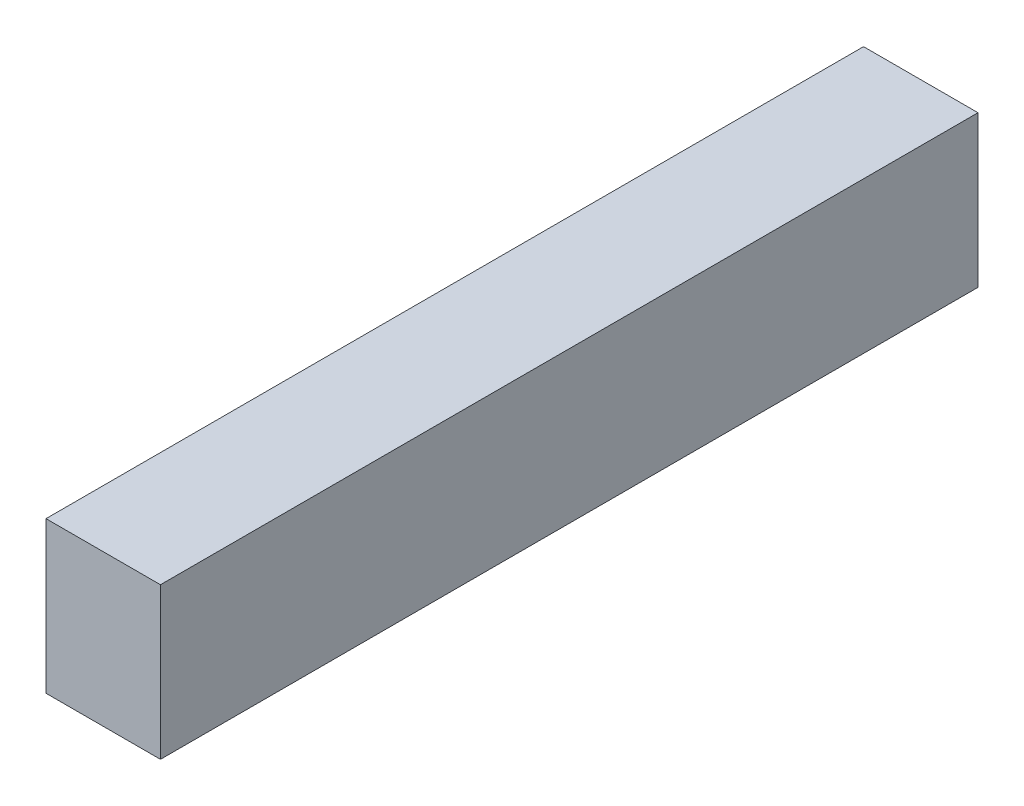
ISO-10303-21;
HEADER;
FILE_DESCRIPTION(('STEP AP214'),'2;1');
FILE_NAME('part.step','',(''),(''),'','','');
FILE_SCHEMA(('AUTOMOTIVE_DESIGN { 1 0 10303 214 1 1 1 1 }'));
ENDSEC;
DATA;
#1=APPLICATION_CONTEXT('core data for automotive mechanical design processes');
#2=APPLICATION_PROTOCOL_DEFINITION('international standard','automotive_design',2000,#1);
#3=PRODUCT_CONTEXT('',#1,'mechanical');
#4=PRODUCT('Part','Part','',(#3));
#5=PRODUCT_RELATED_PRODUCT_CATEGORY('part','',(#4));
#6=PRODUCT_DEFINITION_FORMATION('','',#4);
#7=PRODUCT_DEFINITION_CONTEXT('part definition',#1,'design');
#8=PRODUCT_DEFINITION('design','',#6,#7);
#9=PRODUCT_DEFINITION_SHAPE('','',#8);
#10=(LENGTH_UNIT() NAMED_UNIT(*) SI_UNIT(.MILLI.,.METRE.));
#11=(NAMED_UNIT(*) PLANE_ANGLE_UNIT() SI_UNIT($,.RADIAN.));
#12=(NAMED_UNIT(*) SI_UNIT($,.STERADIAN.) SOLID_ANGLE_UNIT());
#13=UNCERTAINTY_MEASURE_WITH_UNIT(LENGTH_MEASURE(1.E-05),#10,'distance_accuracy_value','');
#14=(GEOMETRIC_REPRESENTATION_CONTEXT(3) GLOBAL_UNCERTAINTY_ASSIGNED_CONTEXT((#13)) GLOBAL_UNIT_ASSIGNED_CONTEXT((#10,
#11,#12)) REPRESENTATION_CONTEXT('',''));
#15=CARTESIAN_POINT('',(0.,0.,0.));
#16=DIRECTION('',(0.,0.,1.));
#17=DIRECTION('',(1.,0.,0.));
#18=AXIS2_PLACEMENT_3D('',#15,#16,#17);
#19=CARTESIAN_POINT('',(1.778,2.3495,-25.4));
#20=DIRECTION('',(1.,0.,0.));
#21=DIRECTION('',(0.,1.,0.));
#22=AXIS2_PLACEMENT_3D('',#19,#20,#21);
#23=PLANE('',#22);
#24=DIRECTION('',(0.,1.,0.));
#25=VECTOR('',#24,1.);
#26=CARTESIAN_POINT('',(1.778,2.3495,0.));
#27=LINE('',#26,#25);
#28=CARTESIAN_POINT('',(1.778,-2.3495,0.));
#29=VERTEX_POINT('',#28);
#30=CARTESIAN_POINT('',(1.778,2.3495,0.));
#31=VERTEX_POINT('',#30);
#32=EDGE_CURVE('E97',#29,#31,#27,.T.);
#33=ORIENTED_EDGE('',*,*,#32,.F.);
#34=DIRECTION('',(0.,0.,1.));
#35=VECTOR('',#34,1.);
#36=CARTESIAN_POINT('',(1.778,-2.3495,-25.4));
#37=LINE('',#36,#35);
#38=CARTESIAN_POINT('',(1.778,-2.3495,-25.4));
#39=VERTEX_POINT('',#38);
#40=EDGE_CURVE('E11',#39,#29,#37,.T.);
#41=ORIENTED_EDGE('',*,*,#40,.F.);
#42=DIRECTION('',(0.,1.,0.));
#43=VECTOR('',#42,1.);
#44=CARTESIAN_POINT('',(1.778,2.3495,-25.4));
#45=LINE('',#44,#43);
#46=CARTESIAN_POINT('',(1.778,2.3495,-25.4));
#47=VERTEX_POINT('',#46);
#48=EDGE_CURVE('E91',#39,#47,#45,.T.);
#49=ORIENTED_EDGE('',*,*,#48,.T.);
#50=DIRECTION('',(0.,0.,1.));
#51=VECTOR('',#50,1.);
#52=CARTESIAN_POINT('',(1.778,2.3495,-25.4));
#53=LINE('',#52,#51);
#54=EDGE_CURVE('E36',#47,#31,#53,.T.);
#55=ORIENTED_EDGE('',*,*,#54,.T.);
#56=EDGE_LOOP('',(#33,#41,#49,#55));
#57=FACE_BOUND('',#56,.T.);
#58=ADVANCED_FACE('F33',(#57),#23,.T.);
#59=CARTESIAN_POINT('',(-1.778,-2.3495,-25.4));
#60=DIRECTION('',(0.,-1.,0.));
#61=DIRECTION('',(0.,0.,-1.));
#62=AXIS2_PLACEMENT_3D('',#59,#60,#61);
#63=PLANE('',#62);
#64=DIRECTION('',(1.,0.,0.));
#65=VECTOR('',#64,1.);
#66=CARTESIAN_POINT('',(-1.778,-2.3495,0.));
#67=LINE('',#66,#65);
#68=CARTESIAN_POINT('',(-1.778,-2.3495,0.));
#69=VERTEX_POINT('',#68);
#70=EDGE_CURVE('E93',#69,#29,#67,.T.);
#71=ORIENTED_EDGE('',*,*,#70,.F.);
#72=DIRECTION('',(0.,0.,1.));
#73=VECTOR('',#72,1.);
#74=CARTESIAN_POINT('',(-1.778,-2.3495,-25.4));
#75=LINE('',#74,#73);
#76=CARTESIAN_POINT('',(-1.778,-2.3495,-25.4));
#77=VERTEX_POINT('',#76);
#78=EDGE_CURVE('E42',#77,#69,#75,.T.);
#79=ORIENTED_EDGE('',*,*,#78,.F.);
#80=DIRECTION('',(1.,0.,0.));
#81=VECTOR('',#80,1.);
#82=CARTESIAN_POINT('',(-1.778,-2.3495,-25.4));
#83=LINE('',#82,#81);
#84=EDGE_CURVE('E88',#77,#39,#83,.T.);
#85=ORIENTED_EDGE('',*,*,#84,.T.);
#86=ORIENTED_EDGE('',*,*,#40,.T.);
#87=EDGE_LOOP('',(#71,#79,#85,#86));
#88=FACE_BOUND('',#87,.T.);
#89=ADVANCED_FACE('F107',(#88),#63,.T.);
#90=CARTESIAN_POINT('',(-1.778,2.3495,-25.4));
#91=DIRECTION('',(-1.,0.,0.));
#92=DIRECTION('',(0.,-1.,0.));
#93=AXIS2_PLACEMENT_3D('',#90,#91,#92);
#94=PLANE('',#93);
#95=DIRECTION('',(0.,-1.,0.));
#96=VECTOR('',#95,1.);
#97=CARTESIAN_POINT('',(-1.778,2.3495,0.));
#98=LINE('',#97,#96);
#99=CARTESIAN_POINT('',(-1.778,2.3495,0.));
#100=VERTEX_POINT('',#99);
#101=EDGE_CURVE('E83',#100,#69,#98,.T.);
#102=ORIENTED_EDGE('',*,*,#101,.F.);
#103=DIRECTION('',(0.,0.,1.));
#104=VECTOR('',#103,1.);
#105=CARTESIAN_POINT('',(-1.778,2.3495,-25.4));
#106=LINE('',#105,#104);
#107=CARTESIAN_POINT('',(-1.778,2.3495,-25.4));
#108=VERTEX_POINT('',#107);
#109=EDGE_CURVE('E78',#108,#100,#106,.T.);
#110=ORIENTED_EDGE('',*,*,#109,.F.);
#111=DIRECTION('',(0.,-1.,0.));
#112=VECTOR('',#111,1.);
#113=CARTESIAN_POINT('',(-1.778,2.3495,-25.4));
#114=LINE('',#113,#112);
#115=EDGE_CURVE('E81',#108,#77,#114,.T.);
#116=ORIENTED_EDGE('',*,*,#115,.T.);
#117=ORIENTED_EDGE('',*,*,#78,.T.);
#118=EDGE_LOOP('',(#102,#110,#116,#117));
#119=FACE_BOUND('',#118,.T.);
#120=ADVANCED_FACE('F80',(#119),#94,.T.);
#121=CARTESIAN_POINT('',(-1.778,2.3495,-25.4));
#122=DIRECTION('',(0.,1.,0.));
#123=DIRECTION('',(0.,0.,1.));
#124=AXIS2_PLACEMENT_3D('',#121,#122,#123);
#125=PLANE('',#124);
#126=DIRECTION('',(-1.,0.,0.));
#127=VECTOR('',#126,1.);
#128=CARTESIAN_POINT('',(-1.778,2.3495,0.));
#129=LINE('',#128,#127);
#130=EDGE_CURVE('E100',#31,#100,#129,.T.);
#131=ORIENTED_EDGE('',*,*,#130,.F.);
#132=ORIENTED_EDGE('',*,*,#54,.F.);
#133=DIRECTION('',(-1.,0.,0.));
#134=VECTOR('',#133,1.);
#135=CARTESIAN_POINT('',(-1.778,2.3495,-25.4));
#136=LINE('',#135,#134);
#137=EDGE_CURVE('E87',#47,#108,#136,.T.);
#138=ORIENTED_EDGE('',*,*,#137,.T.);
#139=ORIENTED_EDGE('',*,*,#109,.T.);
#140=EDGE_LOOP('',(#131,#132,#138,#139));
#141=FACE_BOUND('',#140,.T.);
#142=ADVANCED_FACE('F90',(#141),#125,.T.);
#143=CARTESIAN_POINT('',(1.778,-2.3495,-25.4));
#144=DIRECTION('',(0.,0.,1.));
#145=DIRECTION('',(1.,0.,0.));
#146=AXIS2_PLACEMENT_3D('',#143,#144,#145);
#147=PLANE('',#146);
#148=ORIENTED_EDGE('',*,*,#48,.F.);
#149=ORIENTED_EDGE('',*,*,#84,.F.);
#150=ORIENTED_EDGE('',*,*,#115,.F.);
#151=ORIENTED_EDGE('',*,*,#137,.F.);
#152=EDGE_LOOP('',(#148,#149,#150,#151));
#153=FACE_BOUND('',#152,.T.);
#154=ADVANCED_FACE('F86',(#153),#147,.F.);
#155=CARTESIAN_POINT('',(1.778,-2.3495,0.));
#156=DIRECTION('',(0.,0.,1.));
#157=DIRECTION('',(1.,0.,0.));
#158=AXIS2_PLACEMENT_3D('',#155,#156,#157);
#159=PLANE('',#158);
#160=ORIENTED_EDGE('',*,*,#32,.T.);
#161=ORIENTED_EDGE('',*,*,#130,.T.);
#162=ORIENTED_EDGE('',*,*,#101,.T.);
#163=ORIENTED_EDGE('',*,*,#70,.T.);
#164=EDGE_LOOP('',(#160,#161,#162,#163));
#165=FACE_BOUND('',#164,.T.);
#166=ADVANCED_FACE('F106',(#165),#159,.T.);
#167=CLOSED_SHELL('',(#58,#89,#120,#142,#154,#166));
#168=MANIFOLD_SOLID_BREP('B2',#167);
#169=ADVANCED_BREP_SHAPE_REPRESENTATION('',(#18,#168),#14);
#170=SHAPE_DEFINITION_REPRESENTATION(#9,#169);
ENDSEC;
END-ISO-10303-21;
